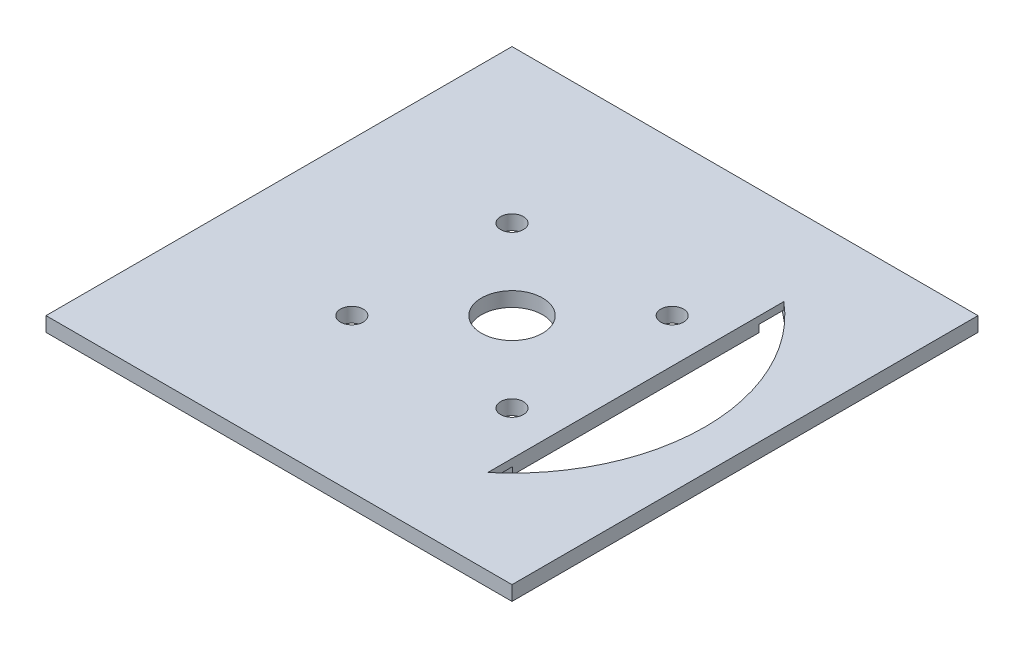
ISO-10303-21;
HEADER;
FILE_DESCRIPTION(('STEP AP214'),'2;1');
FILE_NAME('part.step','',(''),(''),'','','');
FILE_SCHEMA(('AUTOMOTIVE_DESIGN { 1 0 10303 214 1 1 1 1 }'));
ENDSEC;
DATA;
#1=APPLICATION_CONTEXT('core data for automotive mechanical design processes');
#2=APPLICATION_PROTOCOL_DEFINITION('international standard','automotive_design',2000,#1);
#3=PRODUCT_CONTEXT('',#1,'mechanical');
#4=PRODUCT('Part','Part','',(#3));
#5=PRODUCT_RELATED_PRODUCT_CATEGORY('part','',(#4));
#6=PRODUCT_DEFINITION_FORMATION('','',#4);
#7=PRODUCT_DEFINITION_CONTEXT('part definition',#1,'design');
#8=PRODUCT_DEFINITION('design','',#6,#7);
#9=PRODUCT_DEFINITION_SHAPE('','',#8);
#10=(LENGTH_UNIT() NAMED_UNIT(*) SI_UNIT(.MILLI.,.METRE.));
#11=(NAMED_UNIT(*) PLANE_ANGLE_UNIT() SI_UNIT($,.RADIAN.));
#12=(NAMED_UNIT(*) SI_UNIT($,.STERADIAN.) SOLID_ANGLE_UNIT());
#13=UNCERTAINTY_MEASURE_WITH_UNIT(LENGTH_MEASURE(1.E-05),#10,'distance_accuracy_value','');
#14=(GEOMETRIC_REPRESENTATION_CONTEXT(3) GLOBAL_UNCERTAINTY_ASSIGNED_CONTEXT((#13)) GLOBAL_UNIT_ASSIGNED_CONTEXT((#10,
#11,#12)) REPRESENTATION_CONTEXT('',''));
#15=CARTESIAN_POINT('',(0.,0.,0.));
#16=DIRECTION('',(0.,0.,1.));
#17=DIRECTION('',(1.,0.,0.));
#18=AXIS2_PLACEMENT_3D('',#15,#16,#17);
#19=CARTESIAN_POINT('',(0.,-3.175,0.));
#20=DIRECTION('',(0.,-1.,0.));
#21=DIRECTION('',(0.,0.,-1.));
#22=AXIS2_PLACEMENT_3D('',#19,#20,#21);
#23=PLANE('',#22);
#24=CARTESIAN_POINT('',(-34.925,-3.175,34.925));
#25=DIRECTION('',(0.,-1.,0.));
#26=DIRECTION('',(0.,0.,-1.));
#27=AXIS2_PLACEMENT_3D('',#24,#25,#26);
#28=CIRCLE('',#27,4.953);
#29=CARTESIAN_POINT('',(-34.925,-3.175,29.972));
#30=VERTEX_POINT('',#29);
#31=EDGE_CURVE('E127',#30,#30,#28,.T.);
#32=ORIENTED_EDGE('',*,*,#31,.F.);
#33=EDGE_LOOP('',(#32));
#34=FACE_BOUND('',#33,.T.);
#35=CARTESIAN_POINT('',(-34.925,-3.175,-34.925));
#36=DIRECTION('',(0.,-1.,0.));
#37=DIRECTION('',(0.,0.,-1.));
#38=AXIS2_PLACEMENT_3D('',#35,#36,#37);
#39=CIRCLE('',#38,4.953);
#40=CARTESIAN_POINT('',(-34.925,-3.175,-39.878));
#41=VERTEX_POINT('',#40);
#42=EDGE_CURVE('E124',#41,#41,#39,.T.);
#43=ORIENTED_EDGE('',*,*,#42,.F.);
#44=EDGE_LOOP('',(#43));
#45=FACE_BOUND('',#44,.T.);
#46=CARTESIAN_POINT('',(34.925,-3.175,-34.925));
#47=DIRECTION('',(0.,-1.,0.));
#48=DIRECTION('',(0.,0.,-1.));
#49=AXIS2_PLACEMENT_3D('',#46,#47,#48);
#50=CIRCLE('',#49,4.953);
#51=CARTESIAN_POINT('',(34.925,-3.175,-39.878));
#52=VERTEX_POINT('',#51);
#53=EDGE_CURVE('E121',#52,#52,#50,.T.);
#54=ORIENTED_EDGE('',*,*,#53,.F.);
#55=EDGE_LOOP('',(#54));
#56=FACE_BOUND('',#55,.T.);
#57=CARTESIAN_POINT('',(34.925,-3.175,34.925));
#58=DIRECTION('',(0.,-1.,0.));
#59=DIRECTION('',(0.,0.,-1.));
#60=AXIS2_PLACEMENT_3D('',#57,#58,#59);
#61=CIRCLE('',#60,4.953);
#62=CARTESIAN_POINT('',(34.925,-3.175,29.972));
#63=VERTEX_POINT('',#62);
#64=EDGE_CURVE('E118',#63,#63,#61,.T.);
#65=ORIENTED_EDGE('',*,*,#64,.F.);
#66=EDGE_LOOP('',(#65));
#67=FACE_BOUND('',#66,.T.);
#68=CARTESIAN_POINT('',(0.,-3.175,0.));
#69=DIRECTION('',(0.,-1.,0.));
#70=DIRECTION('',(0.,0.,-1.));
#71=AXIS2_PLACEMENT_3D('',#68,#69,#70);
#72=CIRCLE('',#71,13.335);
#73=CARTESIAN_POINT('',(0.,-3.175,-13.335));
#74=VERTEX_POINT('',#73);
#75=EDGE_CURVE('E115',#74,#74,#72,.T.);
#76=ORIENTED_EDGE('',*,*,#75,.F.);
#77=EDGE_LOOP('',(#76));
#78=FACE_BOUND('',#77,.T.);
#79=DIRECTION('',(0.,0.,-1.));
#80=VECTOR('',#79,1.);
#81=CARTESIAN_POINT('',(53.975,-3.175,0.));
#82=LINE('',#81,#80);
#83=CARTESIAN_POINT('',(53.975,-3.175,53.7879110488593));
#84=VERTEX_POINT('',#83);
#85=CARTESIAN_POINT('',(53.975,-3.175,-53.7879110488593));
#86=VERTEX_POINT('',#85);
#87=EDGE_CURVE('E111',#84,#86,#82,.T.);
#88=ORIENTED_EDGE('',*,*,#87,.F.);
#89=CARTESIAN_POINT('',(0.,-3.175,0.));
#90=DIRECTION('',(0.,-1.,0.));
#91=DIRECTION('',(0.,0.,-1.));
#92=AXIS2_PLACEMENT_3D('',#89,#90,#91);
#93=CIRCLE('',#92,76.2);
#94=EDGE_CURVE('E48',#84,#86,#93,.T.);
#95=ORIENTED_EDGE('',*,*,#94,.T.);
#96=EDGE_LOOP('',(#88,#95));
#97=FACE_BOUND('',#96,.T.);
#98=ADVANCED_FACE('F32',(#34,#45,#56,#67,#78,#97),#23,.T.);
#99=CARTESIAN_POINT('',(53.975,-6.35,64.5431505370632));
#100=DIRECTION('',(-1.,0.,0.));
#101=DIRECTION('',(0.,0.,1.));
#102=AXIS2_PLACEMENT_3D('',#99,#100,#101);
#103=PLANE('',#102);
#104=DIRECTION('',(0.,0.,1.));
#105=VECTOR('',#104,1.);
#106=CARTESIAN_POINT('',(53.975,0.,64.5431505370632));
#107=LINE('',#106,#105);
#108=CARTESIAN_POINT('',(53.975,0.,-64.5431505370632));
#109=VERTEX_POINT('',#108);
#110=CARTESIAN_POINT('',(53.975,0.,-53.7879110488593));
#111=VERTEX_POINT('',#110);
#112=EDGE_CURVE('E11',#109,#111,#107,.T.);
#113=ORIENTED_EDGE('',*,*,#112,.F.);
#114=DIRECTION('',(0.,1.,0.));
#115=VECTOR('',#114,1.);
#116=CARTESIAN_POINT('',(53.975,-6.35,-64.5431505370632));
#117=LINE('',#116,#115);
#118=CARTESIAN_POINT('',(53.975,3.175,-64.5431505370632));
#119=VERTEX_POINT('',#118);
#120=EDGE_CURVE('E56',#109,#119,#117,.T.);
#121=ORIENTED_EDGE('',*,*,#120,.T.);
#122=DIRECTION('',(0.,0.,-1.));
#123=VECTOR('',#122,1.);
#124=CARTESIAN_POINT('',(53.975,3.175,0.));
#125=LINE('',#124,#123);
#126=CARTESIAN_POINT('',(53.975,3.175,64.5431505370632));
#127=VERTEX_POINT('',#126);
#128=EDGE_CURVE('E167',#127,#119,#125,.T.);
#129=ORIENTED_EDGE('',*,*,#128,.F.);
#130=DIRECTION('',(0.,1.,0.));
#131=VECTOR('',#130,1.);
#132=CARTESIAN_POINT('',(53.975,-6.35,64.5431505370632));
#133=LINE('',#132,#131);
#134=CARTESIAN_POINT('',(53.975,0.,64.5431505370632));
#135=VERTEX_POINT('',#134);
#136=EDGE_CURVE('E170',#135,#127,#133,.T.);
#137=ORIENTED_EDGE('',*,*,#136,.F.);
#138=CARTESIAN_POINT('',(53.975,0.,53.7879110488593));
#139=VERTEX_POINT('',#138);
#140=EDGE_CURVE('E41',#139,#135,#107,.T.);
#141=ORIENTED_EDGE('',*,*,#140,.F.);
#142=DIRECTION('',(0.,-1.,0.));
#143=VECTOR('',#142,1.);
#144=CARTESIAN_POINT('',(53.975,0.,53.7879110488593));
#145=LINE('',#144,#143);
#146=EDGE_CURVE('E106',#84,#139,#145,.F.);
#147=ORIENTED_EDGE('',*,*,#146,.F.);
#148=ORIENTED_EDGE('',*,*,#87,.T.);
#149=DIRECTION('',(0.,-1.,0.));
#150=VECTOR('',#149,1.);
#151=CARTESIAN_POINT('',(53.975,0.,-53.7879110488593));
#152=LINE('',#151,#150);
#153=EDGE_CURVE('E36',#111,#86,#152,.T.);
#154=ORIENTED_EDGE('',*,*,#153,.F.);
#155=EDGE_LOOP('',(#113,#121,#129,#137,#141,#147,#148,#154));
#156=FACE_BOUND('',#155,.T.);
#157=ADVANCED_FACE('F109',(#156),#103,.F.);
#158=CARTESIAN_POINT('',(101.6,3.175,101.6));
#159=DIRECTION('',(-1.,0.,0.));
#160=DIRECTION('',(0.,0.,1.));
#161=AXIS2_PLACEMENT_3D('',#158,#159,#160);
#162=PLANE('',#161);
#163=DIRECTION('',(0.,0.,-1.));
#164=VECTOR('',#163,1.);
#165=CARTESIAN_POINT('',(101.6,-3.175,101.6));
#166=LINE('',#165,#164);
#167=CARTESIAN_POINT('',(101.6,-3.175,101.6));
#168=VERTEX_POINT('',#167);
#169=CARTESIAN_POINT('',(101.6,-3.175,-101.6));
#170=VERTEX_POINT('',#169);
#171=EDGE_CURVE('E154',#168,#170,#166,.T.);
#172=ORIENTED_EDGE('',*,*,#171,.T.);
#173=DIRECTION('',(0.,-1.,0.));
#174=VECTOR('',#173,1.);
#175=CARTESIAN_POINT('',(101.6,3.175,-101.6));
#176=LINE('',#175,#174);
#177=CARTESIAN_POINT('',(101.6,3.175,-101.6));
#178=VERTEX_POINT('',#177);
#179=EDGE_CURVE('E134',#178,#170,#176,.T.);
#180=ORIENTED_EDGE('',*,*,#179,.F.);
#181=DIRECTION('',(0.,0.,-1.));
#182=VECTOR('',#181,1.);
#183=CARTESIAN_POINT('',(101.6,3.175,101.6));
#184=LINE('',#183,#182);
#185=CARTESIAN_POINT('',(101.6,3.175,101.6));
#186=VERTEX_POINT('',#185);
#187=EDGE_CURVE('E149',#186,#178,#184,.T.);
#188=ORIENTED_EDGE('',*,*,#187,.F.);
#189=DIRECTION('',(0.,-1.,0.));
#190=VECTOR('',#189,1.);
#191=CARTESIAN_POINT('',(101.6,3.175,101.6));
#192=LINE('',#191,#190);
#193=EDGE_CURVE('E143',#186,#168,#192,.T.);
#194=ORIENTED_EDGE('',*,*,#193,.T.);
#195=EDGE_LOOP('',(#172,#180,#188,#194));
#196=FACE_BOUND('',#195,.T.);
#197=ADVANCED_FACE('F34',(#196),#162,.F.);
#198=CARTESIAN_POINT('',(-101.6,3.175,-101.6));
#199=DIRECTION('',(0.,0.,1.));
#200=DIRECTION('',(1.,0.,0.));
#201=AXIS2_PLACEMENT_3D('',#198,#199,#200);
#202=PLANE('',#201);
#203=DIRECTION('',(-1.,0.,0.));
#204=VECTOR('',#203,1.);
#205=CARTESIAN_POINT('',(-101.6,-3.175,-101.6));
#206=LINE('',#205,#204);
#207=CARTESIAN_POINT('',(-101.6,-3.175,-101.6));
#208=VERTEX_POINT('',#207);
#209=EDGE_CURVE('E152',#170,#208,#206,.T.);
#210=ORIENTED_EDGE('',*,*,#209,.T.);
#211=DIRECTION('',(0.,-1.,0.));
#212=VECTOR('',#211,1.);
#213=CARTESIAN_POINT('',(-101.6,3.175,-101.6));
#214=LINE('',#213,#212);
#215=CARTESIAN_POINT('',(-101.6,3.175,-101.6));
#216=VERTEX_POINT('',#215);
#217=EDGE_CURVE('E137',#216,#208,#214,.T.);
#218=ORIENTED_EDGE('',*,*,#217,.F.);
#219=DIRECTION('',(-1.,0.,0.));
#220=VECTOR('',#219,1.);
#221=CARTESIAN_POINT('',(-101.6,3.175,-101.6));
#222=LINE('',#221,#220);
#223=EDGE_CURVE('E161',#178,#216,#222,.T.);
#224=ORIENTED_EDGE('',*,*,#223,.F.);
#225=ORIENTED_EDGE('',*,*,#179,.T.);
#226=EDGE_LOOP('',(#210,#218,#224,#225));
#227=FACE_BOUND('',#226,.T.);
#228=ADVANCED_FACE('F231',(#227),#202,.F.);
#229=CARTESIAN_POINT('',(-101.6,3.175,101.6));
#230=DIRECTION('',(1.,0.,0.));
#231=DIRECTION('',(0.,0.,-1.));
#232=AXIS2_PLACEMENT_3D('',#229,#230,#231);
#233=PLANE('',#232);
#234=DIRECTION('',(0.,0.,1.));
#235=VECTOR('',#234,1.);
#236=CARTESIAN_POINT('',(-101.6,-3.175,101.6));
#237=LINE('',#236,#235);
#238=CARTESIAN_POINT('',(-101.6,-3.175,101.6));
#239=VERTEX_POINT('',#238);
#240=EDGE_CURVE('E150',#208,#239,#237,.T.);
#241=ORIENTED_EDGE('',*,*,#240,.T.);
#242=DIRECTION('',(0.,-1.,0.));
#243=VECTOR('',#242,1.);
#244=CARTESIAN_POINT('',(-101.6,3.175,101.6));
#245=LINE('',#244,#243);
#246=CARTESIAN_POINT('',(-101.6,3.175,101.6));
#247=VERTEX_POINT('',#246);
#248=EDGE_CURVE('E140',#247,#239,#245,.T.);
#249=ORIENTED_EDGE('',*,*,#248,.F.);
#250=DIRECTION('',(0.,0.,1.));
#251=VECTOR('',#250,1.);
#252=CARTESIAN_POINT('',(-101.6,3.175,101.6));
#253=LINE('',#252,#251);
#254=EDGE_CURVE('E159',#216,#247,#253,.T.);
#255=ORIENTED_EDGE('',*,*,#254,.F.);
#256=ORIENTED_EDGE('',*,*,#217,.T.);
#257=EDGE_LOOP('',(#241,#249,#255,#256));
#258=FACE_BOUND('',#257,.T.);
#259=ADVANCED_FACE('F228',(#258),#233,.F.);
#260=CARTESIAN_POINT('',(-101.6,3.175,101.6));
#261=DIRECTION('',(0.,0.,-1.));
#262=DIRECTION('',(-1.,0.,0.));
#263=AXIS2_PLACEMENT_3D('',#260,#261,#262);
#264=PLANE('',#263);
#265=DIRECTION('',(1.,0.,0.));
#266=VECTOR('',#265,1.);
#267=CARTESIAN_POINT('',(-101.6,-3.175,101.6));
#268=LINE('',#267,#266);
#269=EDGE_CURVE('E147',#239,#168,#268,.T.);
#270=ORIENTED_EDGE('',*,*,#269,.T.);
#271=ORIENTED_EDGE('',*,*,#193,.F.);
#272=DIRECTION('',(1.,0.,0.));
#273=VECTOR('',#272,1.);
#274=CARTESIAN_POINT('',(-101.6,3.175,101.6));
#275=LINE('',#274,#273);
#276=EDGE_CURVE('E146',#247,#186,#275,.T.);
#277=ORIENTED_EDGE('',*,*,#276,.F.);
#278=ORIENTED_EDGE('',*,*,#248,.T.);
#279=EDGE_LOOP('',(#270,#271,#277,#278));
#280=FACE_BOUND('',#279,.T.);
#281=ADVANCED_FACE('F212',(#280),#264,.F.);
#282=CARTESIAN_POINT('',(0.,3.175,0.));
#283=DIRECTION('',(0.,-1.,0.));
#284=DIRECTION('',(0.,0.,-1.));
#285=AXIS2_PLACEMENT_3D('',#282,#283,#284);
#286=PLANE('',#285);
#287=CARTESIAN_POINT('',(0.,3.175,0.));
#288=DIRECTION('',(0.,1.,0.));
#289=DIRECTION('',(0.,0.,1.));
#290=AXIS2_PLACEMENT_3D('',#287,#288,#289);
#291=CIRCLE('',#290,13.335);
#292=CARTESIAN_POINT('',(0.,3.175,13.335));
#293=VERTEX_POINT('',#292);
#294=EDGE_CURVE('E176',#293,#293,#291,.T.);
#295=ORIENTED_EDGE('',*,*,#294,.F.);
#296=EDGE_LOOP('',(#295));
#297=FACE_BOUND('',#296,.T.);
#298=CARTESIAN_POINT('',(34.925,3.175,34.925));
#299=DIRECTION('',(0.,1.,0.));
#300=DIRECTION('',(0.,0.,1.));
#301=AXIS2_PLACEMENT_3D('',#298,#299,#300);
#302=CIRCLE('',#301,4.953);
#303=CARTESIAN_POINT('',(34.925,3.175,39.878));
#304=VERTEX_POINT('',#303);
#305=EDGE_CURVE('E179',#304,#304,#302,.T.);
#306=ORIENTED_EDGE('',*,*,#305,.F.);
#307=EDGE_LOOP('',(#306));
#308=FACE_BOUND('',#307,.T.);
#309=CARTESIAN_POINT('',(34.925,3.175,-34.925));
#310=DIRECTION('',(0.,1.,0.));
#311=DIRECTION('',(0.,0.,1.));
#312=AXIS2_PLACEMENT_3D('',#309,#310,#311);
#313=CIRCLE('',#312,4.953);
#314=CARTESIAN_POINT('',(34.925,3.175,-29.972));
#315=VERTEX_POINT('',#314);
#316=EDGE_CURVE('E182',#315,#315,#313,.T.);
#317=ORIENTED_EDGE('',*,*,#316,.F.);
#318=EDGE_LOOP('',(#317));
#319=FACE_BOUND('',#318,.T.);
#320=CARTESIAN_POINT('',(-34.925,3.175,-34.925));
#321=DIRECTION('',(0.,1.,0.));
#322=DIRECTION('',(0.,0.,1.));
#323=AXIS2_PLACEMENT_3D('',#320,#321,#322);
#324=CIRCLE('',#323,4.953);
#325=CARTESIAN_POINT('',(-34.925,3.175,-29.972));
#326=VERTEX_POINT('',#325);
#327=EDGE_CURVE('E175',#326,#326,#324,.T.);
#328=ORIENTED_EDGE('',*,*,#327,.F.);
#329=EDGE_LOOP('',(#328));
#330=FACE_BOUND('',#329,.T.);
#331=CARTESIAN_POINT('',(-34.925,3.175,34.925));
#332=DIRECTION('',(0.,1.,0.));
#333=DIRECTION('',(0.,0.,1.));
#334=AXIS2_PLACEMENT_3D('',#331,#332,#333);
#335=CIRCLE('',#334,4.953);
#336=CARTESIAN_POINT('',(-34.925,3.175,39.878));
#337=VERTEX_POINT('',#336);
#338=EDGE_CURVE('E130',#337,#337,#335,.T.);
#339=ORIENTED_EDGE('',*,*,#338,.F.);
#340=EDGE_LOOP('',(#339));
#341=FACE_BOUND('',#340,.T.);
#342=ORIENTED_EDGE('',*,*,#128,.T.);
#343=CARTESIAN_POINT('',(0.,3.175,0.));
#344=DIRECTION('',(0.,-1.,0.));
#345=DIRECTION('',(0.,0.,-1.));
#346=AXIS2_PLACEMENT_3D('',#343,#344,#345);
#347=CIRCLE('',#346,84.1375);
#348=EDGE_CURVE('E157',#119,#127,#347,.T.);
#349=ORIENTED_EDGE('',*,*,#348,.T.);
#350=EDGE_LOOP('',(#342,#349));
#351=FACE_BOUND('',#350,.T.);
#352=ORIENTED_EDGE('',*,*,#187,.T.);
#353=ORIENTED_EDGE('',*,*,#223,.T.);
#354=ORIENTED_EDGE('',*,*,#254,.T.);
#355=ORIENTED_EDGE('',*,*,#276,.T.);
#356=EDGE_LOOP('',(#352,#353,#354,#355));
#357=FACE_BOUND('',#356,.T.);
#358=ADVANCED_FACE('F203',(#297,#308,#319,#330,#341,#351,#357),#286,.F.);
#359=CARTESIAN_POINT('',(0.,-3.175,0.));
#360=DIRECTION('',(0.,-1.,0.));
#361=DIRECTION('',(0.,0.,-1.));
#362=AXIS2_PLACEMENT_3D('',#359,#360,#361);
#363=CIRCLE('',#362,84.1375);
#364=CARTESIAN_POINT('',(0.,-3.175,-84.1375));
#365=VERTEX_POINT('',#364);
#366=EDGE_CURVE('E112',#365,#365,#363,.T.);
#367=ORIENTED_EDGE('',*,*,#366,.F.);
#368=EDGE_LOOP('',(#367));
#369=FACE_BOUND('',#368,.T.);
#370=ORIENTED_EDGE('',*,*,#171,.F.);
#371=ORIENTED_EDGE('',*,*,#269,.F.);
#372=ORIENTED_EDGE('',*,*,#240,.F.);
#373=ORIENTED_EDGE('',*,*,#209,.F.);
#374=EDGE_LOOP('',(#370,#371,#372,#373));
#375=FACE_BOUND('',#374,.T.);
#376=ADVANCED_FACE('F192',(#369,#375),#23,.T.);
#377=CARTESIAN_POINT('',(0.,-6.35,0.));
#378=DIRECTION('',(0.,1.,0.));
#379=DIRECTION('',(0.,0.,1.));
#380=AXIS2_PLACEMENT_3D('',#377,#378,#379);
#381=CYLINDRICAL_SURFACE('',#380,84.1375);
#382=CARTESIAN_POINT('',(0.,0.,0.));
#383=DIRECTION('',(0.,-1.,0.));
#384=DIRECTION('',(0.,0.,-1.));
#385=AXIS2_PLACEMENT_3D('',#382,#383,#384);
#386=CIRCLE('',#385,84.1375);
#387=EDGE_CURVE('E103',#135,#109,#386,.T.);
#388=ORIENTED_EDGE('',*,*,#387,.F.);
#389=ORIENTED_EDGE('',*,*,#136,.T.);
#390=ORIENTED_EDGE('',*,*,#348,.F.);
#391=ORIENTED_EDGE('',*,*,#120,.F.);
#392=EDGE_LOOP('',(#388,#389,#390,#391));
#393=FACE_BOUND('',#392,.T.);
#394=ORIENTED_EDGE('',*,*,#366,.T.);
#395=EDGE_LOOP('',(#394));
#396=FACE_BOUND('',#395,.T.);
#397=ADVANCED_FACE('F202',(#393,#396),#381,.F.);
#398=CARTESIAN_POINT('',(-34.925,-9.525,34.925));
#399=DIRECTION('',(0.,1.,0.));
#400=DIRECTION('',(0.,0.,1.));
#401=AXIS2_PLACEMENT_3D('',#398,#399,#400);
#402=CYLINDRICAL_SURFACE('',#401,4.953);
#403=ORIENTED_EDGE('',*,*,#31,.T.);
#404=EDGE_LOOP('',(#403));
#405=FACE_BOUND('',#404,.T.);
#406=ORIENTED_EDGE('',*,*,#338,.T.);
#407=EDGE_LOOP('',(#406));
#408=FACE_BOUND('',#407,.T.);
#409=ADVANCED_FACE('F209',(#405,#408),#402,.F.);
#410=CARTESIAN_POINT('',(-34.925,-9.525,-34.925));
#411=DIRECTION('',(0.,1.,0.));
#412=DIRECTION('',(0.,0.,1.));
#413=AXIS2_PLACEMENT_3D('',#410,#411,#412);
#414=CYLINDRICAL_SURFACE('',#413,4.953);
#415=ORIENTED_EDGE('',*,*,#42,.T.);
#416=EDGE_LOOP('',(#415));
#417=FACE_BOUND('',#416,.T.);
#418=ORIENTED_EDGE('',*,*,#327,.T.);
#419=EDGE_LOOP('',(#418));
#420=FACE_BOUND('',#419,.T.);
#421=ADVANCED_FACE('F258',(#417,#420),#414,.F.);
#422=CARTESIAN_POINT('',(34.925,-9.525,-34.925));
#423=DIRECTION('',(0.,1.,0.));
#424=DIRECTION('',(0.,0.,1.));
#425=AXIS2_PLACEMENT_3D('',#422,#423,#424);
#426=CYLINDRICAL_SURFACE('',#425,4.953);
#427=ORIENTED_EDGE('',*,*,#53,.T.);
#428=EDGE_LOOP('',(#427));
#429=FACE_BOUND('',#428,.T.);
#430=ORIENTED_EDGE('',*,*,#316,.T.);
#431=EDGE_LOOP('',(#430));
#432=FACE_BOUND('',#431,.T.);
#433=ADVANCED_FACE('F269',(#429,#432),#426,.F.);
#434=CARTESIAN_POINT('',(34.925,-9.525,34.925));
#435=DIRECTION('',(0.,1.,0.));
#436=DIRECTION('',(0.,0.,1.));
#437=AXIS2_PLACEMENT_3D('',#434,#435,#436);
#438=CYLINDRICAL_SURFACE('',#437,4.953);
#439=ORIENTED_EDGE('',*,*,#64,.T.);
#440=EDGE_LOOP('',(#439));
#441=FACE_BOUND('',#440,.T.);
#442=ORIENTED_EDGE('',*,*,#305,.T.);
#443=EDGE_LOOP('',(#442));
#444=FACE_BOUND('',#443,.T.);
#445=ADVANCED_FACE('F279',(#441,#444),#438,.F.);
#446=CARTESIAN_POINT('',(0.,-9.525,0.));
#447=DIRECTION('',(0.,1.,0.));
#448=DIRECTION('',(0.,0.,1.));
#449=AXIS2_PLACEMENT_3D('',#446,#447,#448);
#450=CYLINDRICAL_SURFACE('',#449,13.335);
#451=ORIENTED_EDGE('',*,*,#75,.T.);
#452=EDGE_LOOP('',(#451));
#453=FACE_BOUND('',#452,.T.);
#454=ORIENTED_EDGE('',*,*,#294,.T.);
#455=EDGE_LOOP('',(#454));
#456=FACE_BOUND('',#455,.T.);
#457=ADVANCED_FACE('F289',(#453,#456),#450,.F.);
#458=CARTESIAN_POINT('',(0.,0.,0.));
#459=DIRECTION('',(0.,-1.,0.));
#460=DIRECTION('',(0.,0.,-1.));
#461=AXIS2_PLACEMENT_3D('',#458,#459,#460);
#462=PLANE('',#461);
#463=ORIENTED_EDGE('',*,*,#112,.T.);
#464=CARTESIAN_POINT('',(0.,0.,0.));
#465=DIRECTION('',(0.,-1.,0.));
#466=DIRECTION('',(0.,0.,-1.));
#467=AXIS2_PLACEMENT_3D('',#464,#465,#466);
#468=CIRCLE('',#467,76.2);
#469=EDGE_CURVE('E100',#139,#111,#468,.T.);
#470=ORIENTED_EDGE('',*,*,#469,.F.);
#471=ORIENTED_EDGE('',*,*,#140,.T.);
#472=ORIENTED_EDGE('',*,*,#387,.T.);
#473=EDGE_LOOP('',(#463,#470,#471,#472));
#474=FACE_BOUND('',#473,.T.);
#475=ADVANCED_FACE('F99',(#474),#462,.T.);
#476=CARTESIAN_POINT('',(0.,0.,0.));
#477=DIRECTION('',(0.,-1.,0.));
#478=DIRECTION('',(0.,0.,-1.));
#479=AXIS2_PLACEMENT_3D('',#476,#477,#478);
#480=CYLINDRICAL_SURFACE('',#479,76.2);
#481=ORIENTED_EDGE('',*,*,#153,.T.);
#482=ORIENTED_EDGE('',*,*,#94,.F.);
#483=ORIENTED_EDGE('',*,*,#146,.T.);
#484=ORIENTED_EDGE('',*,*,#469,.T.);
#485=EDGE_LOOP('',(#481,#482,#483,#484));
#486=FACE_BOUND('',#485,.T.);
#487=ADVANCED_FACE('F105',(#486),#480,.T.);
#488=CLOSED_SHELL('',(#98,#157,#197,#228,#259,#281,#358,#376,#397,#409,#421,#433,#445,#457,#475,#487));
#489=MANIFOLD_SOLID_BREP('B2',#488);
#490=ADVANCED_BREP_SHAPE_REPRESENTATION('',(#18,#489),#14);
#491=SHAPE_DEFINITION_REPRESENTATION(#9,#490);
ENDSEC;
END-ISO-10303-21;
